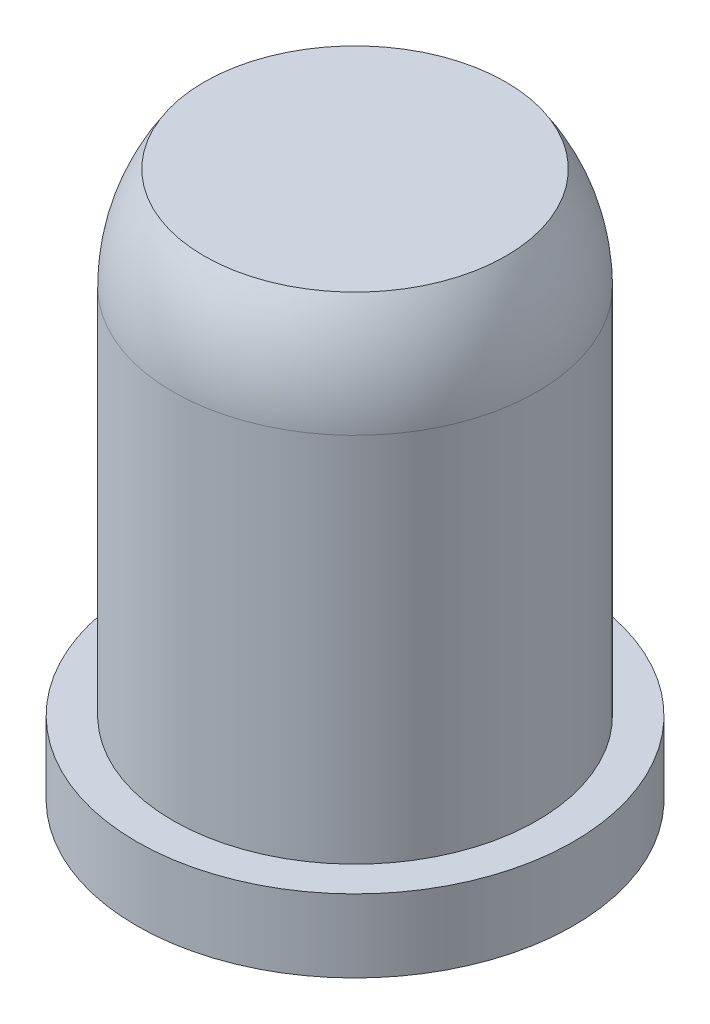
ISO-10303-21;
HEADER;
FILE_DESCRIPTION(('STEP AP214'),'2;1');
FILE_NAME('part.step','',(''),(''),'','','');
FILE_SCHEMA(('AUTOMOTIVE_DESIGN { 1 0 10303 214 1 1 1 1 }'));
ENDSEC;
DATA;
#1=APPLICATION_CONTEXT('core data for automotive mechanical design processes');
#2=APPLICATION_PROTOCOL_DEFINITION('international standard','automotive_design',2000,#1);
#3=PRODUCT_CONTEXT('',#1,'mechanical');
#4=PRODUCT('Part','Part','',(#3));
#5=PRODUCT_RELATED_PRODUCT_CATEGORY('part','',(#4));
#6=PRODUCT_DEFINITION_FORMATION('','',#4);
#7=PRODUCT_DEFINITION_CONTEXT('part definition',#1,'design');
#8=PRODUCT_DEFINITION('design','',#6,#7);
#9=PRODUCT_DEFINITION_SHAPE('','',#8);
#10=(LENGTH_UNIT() NAMED_UNIT(*) SI_UNIT(.MILLI.,.METRE.));
#11=(NAMED_UNIT(*) PLANE_ANGLE_UNIT() SI_UNIT($,.RADIAN.));
#12=(NAMED_UNIT(*) SI_UNIT($,.STERADIAN.) SOLID_ANGLE_UNIT());
#13=UNCERTAINTY_MEASURE_WITH_UNIT(LENGTH_MEASURE(1.E-05),#10,'distance_accuracy_value','');
#14=(GEOMETRIC_REPRESENTATION_CONTEXT(3) GLOBAL_UNCERTAINTY_ASSIGNED_CONTEXT((#13)) GLOBAL_UNIT_ASSIGNED_CONTEXT((#10,
#11,#12)) REPRESENTATION_CONTEXT('',''));
#15=CARTESIAN_POINT('',(0.,0.,0.));
#16=DIRECTION('',(0.,0.,1.));
#17=DIRECTION('',(1.,0.,0.));
#18=AXIS2_PLACEMENT_3D('',#15,#16,#17);
#19=CARTESIAN_POINT('',(0.,6.1,0.));
#20=DIRECTION('',(0.,1.,0.));
#21=DIRECTION('',(0.,0.,1.));
#22=AXIS2_PLACEMENT_3D('',#19,#20,#21);
#23=SPHERICAL_SURFACE('',#22,2.5);
#24=CARTESIAN_POINT('',(0.,6.1,0.));
#25=DIRECTION('',(0.,-1.,0.));
#26=DIRECTION('',(0.,0.,-1.));
#27=AXIS2_PLACEMENT_3D('',#24,#25,#26);
#28=CIRCLE('',#27,2.5);
#29=CARTESIAN_POINT('',(0.,6.1,-2.5));
#30=VERTEX_POINT('',#29);
#31=EDGE_CURVE('E12',#30,#30,#28,.T.);
#32=ORIENTED_EDGE('',*,*,#31,.F.);
#33=EDGE_LOOP('',(#32));
#34=FACE_BOUND('',#33,.T.);
#35=CARTESIAN_POINT('',(0.,7.5,0.));
#36=DIRECTION('',(0.,1.,0.));
#37=DIRECTION('',(0.,0.,1.));
#38=AXIS2_PLACEMENT_3D('',#35,#36,#37);
#39=CIRCLE('',#38,2.0712315177208);
#40=CARTESIAN_POINT('',(0.,7.5,2.0712315177208));
#41=VERTEX_POINT('',#40);
#42=EDGE_CURVE('E47',#41,#41,#39,.F.);
#43=ORIENTED_EDGE('',*,*,#42,.T.);
#44=EDGE_LOOP('',(#43));
#45=FACE_BOUND('',#44,.T.);
#46=ADVANCED_FACE('F44',(#34,#45),#23,.T.);
#47=CARTESIAN_POINT('',(0.,1.,0.));
#48=DIRECTION('',(0.,-1.,0.));
#49=DIRECTION('',(0.,0.,-1.));
#50=AXIS2_PLACEMENT_3D('',#47,#48,#49);
#51=CYLINDRICAL_SURFACE('',#50,3.);
#52=CARTESIAN_POINT('',(0.,1.,0.));
#53=DIRECTION('',(0.,1.,0.));
#54=DIRECTION('',(0.,0.,1.));
#55=AXIS2_PLACEMENT_3D('',#52,#53,#54);
#56=CIRCLE('',#55,3.);
#57=CARTESIAN_POINT('',(0.,1.,3.));
#58=VERTEX_POINT('',#57);
#59=EDGE_CURVE('E55',#58,#58,#56,.T.);
#60=ORIENTED_EDGE('',*,*,#59,.F.);
#61=EDGE_LOOP('',(#60));
#62=FACE_BOUND('',#61,.T.);
#63=CARTESIAN_POINT('',(0.,0.,0.));
#64=DIRECTION('',(0.,1.,0.));
#65=DIRECTION('',(0.,0.,1.));
#66=AXIS2_PLACEMENT_3D('',#63,#64,#65);
#67=CIRCLE('',#66,3.);
#68=CARTESIAN_POINT('',(0.,0.,3.));
#69=VERTEX_POINT('',#68);
#70=EDGE_CURVE('E58',#69,#69,#67,.T.);
#71=ORIENTED_EDGE('',*,*,#70,.T.);
#72=EDGE_LOOP('',(#71));
#73=FACE_BOUND('',#72,.T.);
#74=ADVANCED_FACE('F66',(#62,#73),#51,.T.);
#75=CARTESIAN_POINT('',(0.,1.,0.));
#76=DIRECTION('',(0.,1.,0.));
#77=DIRECTION('',(0.,0.,1.));
#78=AXIS2_PLACEMENT_3D('',#75,#76,#77);
#79=PLANE('',#78);
#80=CARTESIAN_POINT('',(0.,1.,0.));
#81=DIRECTION('',(0.,1.,0.));
#82=DIRECTION('',(0.,0.,1.));
#83=AXIS2_PLACEMENT_3D('',#80,#81,#82);
#84=CIRCLE('',#83,2.5);
#85=CARTESIAN_POINT('',(0.,1.,-2.5));
#86=VERTEX_POINT('',#85);
#87=EDGE_CURVE('E51',#86,#86,#84,.T.);
#88=ORIENTED_EDGE('',*,*,#87,.F.);
#89=EDGE_LOOP('',(#88));
#90=FACE_BOUND('',#89,.T.);
#91=ORIENTED_EDGE('',*,*,#59,.T.);
#92=EDGE_LOOP('',(#91));
#93=FACE_BOUND('',#92,.T.);
#94=ADVANCED_FACE('F64',(#90,#93),#79,.T.);
#95=CARTESIAN_POINT('',(0.,0.,0.));
#96=DIRECTION('',(0.,1.,0.));
#97=DIRECTION('',(0.,0.,1.));
#98=AXIS2_PLACEMENT_3D('',#95,#96,#97);
#99=PLANE('',#98);
#100=ORIENTED_EDGE('',*,*,#70,.F.);
#101=EDGE_LOOP('',(#100));
#102=FACE_BOUND('',#101,.T.);
#103=ADVANCED_FACE('F71',(#102),#99,.F.);
#104=CARTESIAN_POINT('',(0.,8.6,0.));
#105=DIRECTION('',(0.,-1.,0.));
#106=DIRECTION('',(0.,0.,-1.));
#107=AXIS2_PLACEMENT_3D('',#104,#105,#106);
#108=CYLINDRICAL_SURFACE('',#107,2.5);
#109=CARTESIAN_POINT('',(0.,6.1,-2.5));
#110=CARTESIAN_POINT('',(0.,6.046875,-2.5));
#111=CARTESIAN_POINT('',(0.,5.99375,-2.5));
#112=CARTESIAN_POINT('',(0.,5.8875,-2.5));
#113=CARTESIAN_POINT('',(0.,5.834375,-2.5));
#114=CARTESIAN_POINT('',(0.,5.728125,-2.5));
#115=CARTESIAN_POINT('',(0.,5.675,-2.5));
#116=CARTESIAN_POINT('',(0.,5.56875,-2.5));
#117=CARTESIAN_POINT('',(0.,5.515625,-2.5));
#118=CARTESIAN_POINT('',(0.,5.409375,-2.5));
#119=CARTESIAN_POINT('',(0.,5.35625,-2.5));
#120=CARTESIAN_POINT('',(0.,5.25,-2.5));
#121=CARTESIAN_POINT('',(0.,5.196875,-2.5));
#122=CARTESIAN_POINT('',(0.,5.090625,-2.5));
#123=CARTESIAN_POINT('',(0.,5.0375,-2.5));
#124=CARTESIAN_POINT('',(0.,4.93125,-2.5));
#125=CARTESIAN_POINT('',(0.,4.878125,-2.5));
#126=CARTESIAN_POINT('',(0.,4.771875,-2.5));
#127=CARTESIAN_POINT('',(0.,4.71875,-2.5));
#128=CARTESIAN_POINT('',(0.,4.6125,-2.5));
#129=CARTESIAN_POINT('',(0.,4.559375,-2.5));
#130=CARTESIAN_POINT('',(0.,4.453125,-2.5));
#131=CARTESIAN_POINT('',(0.,4.4,-2.5));
#132=CARTESIAN_POINT('',(0.,4.29375,-2.5));
#133=CARTESIAN_POINT('',(0.,4.240625,-2.5));
#134=CARTESIAN_POINT('',(0.,4.134375,-2.5));
#135=CARTESIAN_POINT('',(0.,4.08125,-2.5));
#136=CARTESIAN_POINT('',(0.,3.975,-2.5));
#137=CARTESIAN_POINT('',(0.,3.921875,-2.5));
#138=CARTESIAN_POINT('',(0.,3.815625,-2.5));
#139=CARTESIAN_POINT('',(0.,3.7625,-2.5));
#140=CARTESIAN_POINT('',(0.,3.65625,-2.5));
#141=CARTESIAN_POINT('',(0.,3.603125,-2.5));
#142=CARTESIAN_POINT('',(0.,3.496875,-2.5));
#143=CARTESIAN_POINT('',(0.,3.44375,-2.5));
#144=CARTESIAN_POINT('',(0.,3.3375,-2.5));
#145=CARTESIAN_POINT('',(0.,3.284375,-2.5));
#146=CARTESIAN_POINT('',(0.,3.178125,-2.5));
#147=CARTESIAN_POINT('',(0.,3.125,-2.5));
#148=CARTESIAN_POINT('',(0.,3.01875,-2.5));
#149=CARTESIAN_POINT('',(0.,2.965625,-2.5));
#150=CARTESIAN_POINT('',(0.,2.859375,-2.5));
#151=CARTESIAN_POINT('',(0.,2.80625,-2.5));
#152=CARTESIAN_POINT('',(0.,2.7,-2.5));
#153=CARTESIAN_POINT('',(0.,2.646875,-2.5));
#154=CARTESIAN_POINT('',(0.,2.540625,-2.5));
#155=CARTESIAN_POINT('',(0.,2.4875,-2.5));
#156=CARTESIAN_POINT('',(0.,2.38125,-2.5));
#157=CARTESIAN_POINT('',(0.,2.328125,-2.5));
#158=CARTESIAN_POINT('',(0.,2.221875,-2.5));
#159=CARTESIAN_POINT('',(0.,2.16875,-2.5));
#160=CARTESIAN_POINT('',(0.,2.0625,-2.5));
#161=CARTESIAN_POINT('',(0.,2.009375,-2.5));
#162=CARTESIAN_POINT('',(0.,1.903125,-2.5));
#163=CARTESIAN_POINT('',(0.,1.85,-2.5));
#164=CARTESIAN_POINT('',(0.,1.74375,-2.5));
#165=CARTESIAN_POINT('',(0.,1.690625,-2.5));
#166=CARTESIAN_POINT('',(0.,1.584375,-2.5));
#167=CARTESIAN_POINT('',(0.,1.53125,-2.5));
#168=CARTESIAN_POINT('',(0.,1.425,-2.5));
#169=CARTESIAN_POINT('',(0.,1.371875,-2.5));
#170=CARTESIAN_POINT('',(0.,1.265625,-2.5));
#171=CARTESIAN_POINT('',(0.,1.2125,-2.5));
#172=CARTESIAN_POINT('',(0.,1.10625,-2.5));
#173=CARTESIAN_POINT('',(0.,1.053125,-2.5));
#174=CARTESIAN_POINT('',(0.,1.,-2.5));
#175=B_SPLINE_CURVE_WITH_KNOTS('',3,(#109,#110,#111,#112,#113,#114,#115,#116,#117,#118,#119,
#120,#121,#122,#123,#124,#125,#126,#127,#128,#129,#130,#131,#132,#133,#134,#135,#136,#137,#138,
#139,#140,#141,#142,#143,#144,#145,#146,#147,#148,#149,#150,#151,#152,#153,#154,#155,#156,#157,
#158,#159,#160,#161,#162,#163,#164,#165,#166,#167,#168,#169,#170,#171,#172,#173,#174),
.UNSPECIFIED.,.F.,.F.,(4,2,2,2,2,2,2,2,2,2,2,2,2,2,2,2,2,2,2,2,2,2,2,2,2,2,2,2,2,2,2,2,4),(0.,
0.159375,0.31875,0.478124999999999,0.637499999999999,0.796874999999999,0.95625,1.115625,1.275,
1.434375,1.59375,1.753125,1.9125,2.071875,2.23125,2.390625,2.55,2.709375,2.86875,3.028125,
3.1875,3.346875,3.50625,3.665625,3.825,3.984375,4.14375,4.303125,4.4625,4.621875,4.78125,
4.940625,5.1),.UNSPECIFIED.);
#176=EDGE_CURVE('BSEAM73',#30,#86,#175,.T.);
#177=ORIENTED_EDGE('',*,*,#31,.T.);
#178=ORIENTED_EDGE('',*,*,#87,.T.);
#179=ORIENTED_EDGE('',*,*,#176,.T.);
#180=ORIENTED_EDGE('',*,*,#176,.F.);
#181=EDGE_LOOP('',(#177,#179,#178,#180));
#182=FACE_BOUND('',#181,.T.);
#183=ADVANCED_FACE('F73',(#182),#108,.T.);
#184=CARTESIAN_POINT('',(0.,7.5,0.));
#185=DIRECTION('',(0.,1.,0.));
#186=DIRECTION('',(0.,0.,1.));
#187=AXIS2_PLACEMENT_3D('',#184,#185,#186);
#188=PLANE('',#187);
#189=ORIENTED_EDGE('',*,*,#42,.F.);
#190=EDGE_LOOP('',(#189));
#191=FACE_BOUND('',#190,.T.);
#192=ADVANCED_FACE('F79',(#191),#188,.T.);
#193=CLOSED_SHELL('',(#46,#74,#94,#103,#183,#192));
#194=MANIFOLD_SOLID_BREP('B2',#193);
#195=ADVANCED_BREP_SHAPE_REPRESENTATION('',(#18,#194),#14);
#196=SHAPE_DEFINITION_REPRESENTATION(#9,#195);
ENDSEC;
END-ISO-10303-21;
